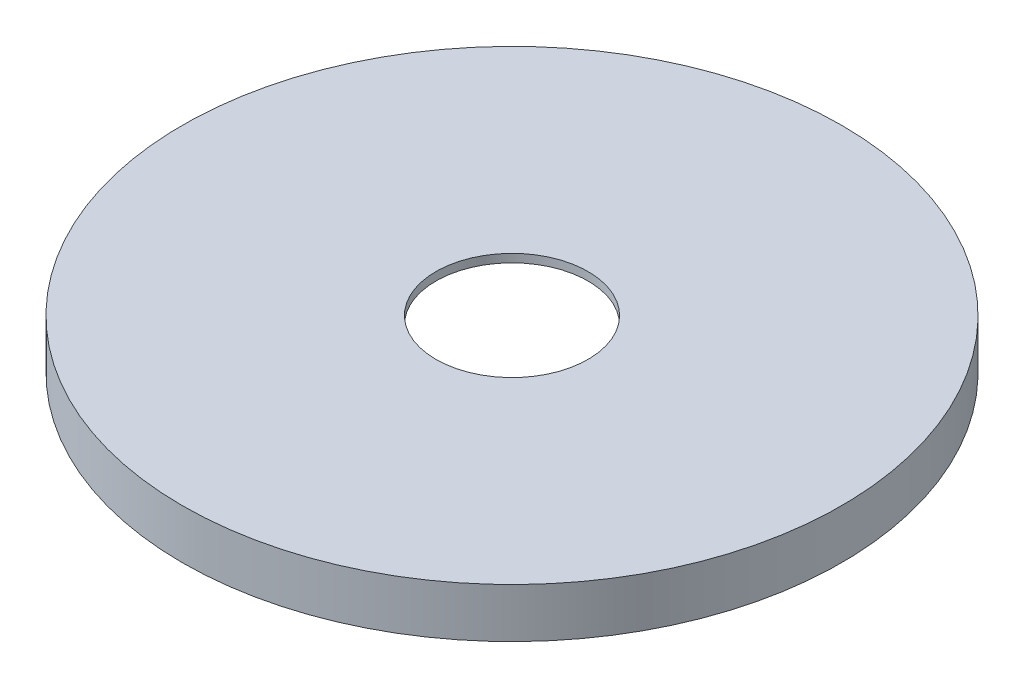
ISO-10303-21;
HEADER;
FILE_DESCRIPTION(('STEP AP214'),'2;1');
FILE_NAME('part.step','',(''),(''),'','','');
FILE_SCHEMA(('AUTOMOTIVE_DESIGN { 1 0 10303 214 1 1 1 1 }'));
ENDSEC;
DATA;
#1=APPLICATION_CONTEXT('core data for automotive mechanical design processes');
#2=APPLICATION_PROTOCOL_DEFINITION('international standard','automotive_design',2000,#1);
#3=PRODUCT_CONTEXT('',#1,'mechanical');
#4=PRODUCT('Part','Part','',(#3));
#5=PRODUCT_RELATED_PRODUCT_CATEGORY('part','',(#4));
#6=PRODUCT_DEFINITION_FORMATION('','',#4);
#7=PRODUCT_DEFINITION_CONTEXT('part definition',#1,'design');
#8=PRODUCT_DEFINITION('design','',#6,#7);
#9=PRODUCT_DEFINITION_SHAPE('','',#8);
#10=(LENGTH_UNIT() NAMED_UNIT(*) SI_UNIT(.MILLI.,.METRE.));
#11=(NAMED_UNIT(*) PLANE_ANGLE_UNIT() SI_UNIT($,.RADIAN.));
#12=(NAMED_UNIT(*) SI_UNIT($,.STERADIAN.) SOLID_ANGLE_UNIT());
#13=UNCERTAINTY_MEASURE_WITH_UNIT(LENGTH_MEASURE(1.E-05),#10,'distance_accuracy_value','');
#14=(GEOMETRIC_REPRESENTATION_CONTEXT(3) GLOBAL_UNCERTAINTY_ASSIGNED_CONTEXT((#13)) GLOBAL_UNIT_ASSIGNED_CONTEXT((#10,
#11,#12)) REPRESENTATION_CONTEXT('',''));
#15=CARTESIAN_POINT('',(0.,0.,0.));
#16=DIRECTION('',(0.,0.,1.));
#17=DIRECTION('',(1.,0.,0.));
#18=AXIS2_PLACEMENT_3D('',#15,#16,#17);
#19=CARTESIAN_POINT('',(-40.,-1.,16.9117227014844));
#20=DIRECTION('',(0.,1.,0.));
#21=DIRECTION('',(0.,0.,1.));
#22=AXIS2_PLACEMENT_3D('',#19,#20,#21);
#23=PLANE('',#22);
#24=CARTESIAN_POINT('',(0.,-1.,16.9117227014844));
#25=DIRECTION('',(0.,1.,0.));
#26=DIRECTION('',(0.,0.,1.));
#27=AXIS2_PLACEMENT_3D('',#24,#25,#26);
#28=CIRCLE('',#27,9.23661741603665);
#29=CARTESIAN_POINT('',(0.,-1.,26.148340117521));
#30=VERTEX_POINT('',#29);
#31=EDGE_CURVE('E50',#30,#30,#28,.F.);
#32=ORIENTED_EDGE('',*,*,#31,.F.);
#33=EDGE_LOOP('',(#32));
#34=FACE_BOUND('',#33,.T.);
#35=CARTESIAN_POINT('',(0.,-1.,16.9117227014844));
#36=DIRECTION('',(0.,-1.,0.));
#37=DIRECTION('',(0.,0.,-1.));
#38=AXIS2_PLACEMENT_3D('',#35,#36,#37);
#39=CIRCLE('',#38,39.);
#40=CARTESIAN_POINT('',(0.,-1.,-22.0882772985156));
#41=VERTEX_POINT('',#40);
#42=EDGE_CURVE('E10',#41,#41,#39,.T.);
#43=ORIENTED_EDGE('',*,*,#42,.T.);
#44=EDGE_LOOP('',(#43));
#45=FACE_BOUND('',#44,.T.);
#46=ADVANCED_FACE('F31',(#34,#45),#23,.F.);
#47=CARTESIAN_POINT('',(0.,0.,16.9117227014844));
#48=DIRECTION('',(0.,-1.,0.));
#49=DIRECTION('',(0.,0.,-1.));
#50=AXIS2_PLACEMENT_3D('',#47,#48,#49);
#51=CYLINDRICAL_SURFACE('',#50,39.);
#52=ORIENTED_EDGE('',*,*,#42,.F.);
#53=EDGE_LOOP('',(#52));
#54=FACE_BOUND('',#53,.T.);
#55=CARTESIAN_POINT('',(0.,-6.00000000000001,16.9117227014844));
#56=DIRECTION('',(0.,-1.,0.));
#57=DIRECTION('',(0.,0.,-1.));
#58=AXIS2_PLACEMENT_3D('',#55,#56,#57);
#59=CIRCLE('',#58,39.);
#60=CARTESIAN_POINT('',(0.,-6.00000000000001,-22.0882772985156));
#61=VERTEX_POINT('',#60);
#62=EDGE_CURVE('E37',#61,#61,#59,.T.);
#63=ORIENTED_EDGE('',*,*,#62,.T.);
#64=EDGE_LOOP('',(#63));
#65=FACE_BOUND('',#64,.T.);
#66=ADVANCED_FACE('F74',(#54,#65),#51,.F.);
#67=CARTESIAN_POINT('',(-39.,-6.00000000000001,16.9117227014844));
#68=DIRECTION('',(0.,-1.,0.));
#69=DIRECTION('',(0.,0.,-1.));
#70=AXIS2_PLACEMENT_3D('',#67,#68,#69);
#71=PLANE('',#70);
#72=CARTESIAN_POINT('',(0.,-6.00000000000001,16.9117227014844));
#73=DIRECTION('',(0.,-1.,0.));
#74=DIRECTION('',(0.,0.,-1.));
#75=AXIS2_PLACEMENT_3D('',#72,#73,#74);
#76=CIRCLE('',#75,40.);
#77=CARTESIAN_POINT('',(0.,-6.00000000000001,-23.0882772985156));
#78=VERTEX_POINT('',#77);
#79=EDGE_CURVE('E41',#78,#78,#76,.T.);
#80=ORIENTED_EDGE('',*,*,#79,.T.);
#81=EDGE_LOOP('',(#80));
#82=FACE_BOUND('',#81,.T.);
#83=ORIENTED_EDGE('',*,*,#62,.F.);
#84=EDGE_LOOP('',(#83));
#85=FACE_BOUND('',#84,.T.);
#86=ADVANCED_FACE('F68',(#82,#85),#71,.T.);
#87=CARTESIAN_POINT('',(0.,0.,16.9117227014844));
#88=DIRECTION('',(0.,-1.,0.));
#89=DIRECTION('',(0.,0.,-1.));
#90=AXIS2_PLACEMENT_3D('',#87,#88,#89);
#91=CYLINDRICAL_SURFACE('',#90,40.);
#92=CARTESIAN_POINT('',(0.,0.,16.9117227014844));
#93=DIRECTION('',(0.,-1.,0.));
#94=DIRECTION('',(0.,0.,-1.));
#95=AXIS2_PLACEMENT_3D('',#92,#93,#94);
#96=CIRCLE('',#95,40.);
#97=CARTESIAN_POINT('',(0.,0.,-23.0882772985156));
#98=VERTEX_POINT('',#97);
#99=EDGE_CURVE('E45',#98,#98,#96,.T.);
#100=ORIENTED_EDGE('',*,*,#99,.T.);
#101=EDGE_LOOP('',(#100));
#102=FACE_BOUND('',#101,.T.);
#103=ORIENTED_EDGE('',*,*,#79,.F.);
#104=EDGE_LOOP('',(#103));
#105=FACE_BOUND('',#104,.T.);
#106=ADVANCED_FACE('F62',(#102,#105),#91,.T.);
#107=CARTESIAN_POINT('',(-40.,0.,16.9117227014844));
#108=DIRECTION('',(0.,1.,0.));
#109=DIRECTION('',(0.,0.,1.));
#110=AXIS2_PLACEMENT_3D('',#107,#108,#109);
#111=PLANE('',#110);
#112=CARTESIAN_POINT('',(0.,0.,16.9117227014844));
#113=DIRECTION('',(0.,1.,0.));
#114=DIRECTION('',(0.,0.,1.));
#115=AXIS2_PLACEMENT_3D('',#112,#113,#114);
#116=CIRCLE('',#115,9.23661741603665);
#117=CARTESIAN_POINT('',(0.,0.,26.148340117521));
#118=VERTEX_POINT('',#117);
#119=EDGE_CURVE('E53',#118,#118,#116,.T.);
#120=ORIENTED_EDGE('',*,*,#119,.F.);
#121=EDGE_LOOP('',(#120));
#122=FACE_BOUND('',#121,.T.);
#123=ORIENTED_EDGE('',*,*,#99,.F.);
#124=EDGE_LOOP('',(#123));
#125=FACE_BOUND('',#124,.T.);
#126=ADVANCED_FACE('F59',(#122,#125),#111,.T.);
#127=CARTESIAN_POINT('',(0.,-27.1250992404211,16.9117227014844));
#128=DIRECTION('',(0.,1.,0.));
#129=DIRECTION('',(0.,0.,1.));
#130=AXIS2_PLACEMENT_3D('',#127,#128,#129);
#131=CYLINDRICAL_SURFACE('',#130,9.23661741603665);
#132=ORIENTED_EDGE('',*,*,#31,.T.);
#133=EDGE_LOOP('',(#132));
#134=FACE_BOUND('',#133,.T.);
#135=ORIENTED_EDGE('',*,*,#119,.T.);
#136=EDGE_LOOP('',(#135));
#137=FACE_BOUND('',#136,.T.);
#138=ADVANCED_FACE('F57',(#134,#137),#131,.F.);
#139=CLOSED_SHELL('',(#46,#66,#86,#106,#126,#138));
#140=MANIFOLD_SOLID_BREP('B2',#139);
#141=ADVANCED_BREP_SHAPE_REPRESENTATION('',(#18,#140),#14);
#142=SHAPE_DEFINITION_REPRESENTATION(#9,#141);
ENDSEC;
END-ISO-10303-21;
